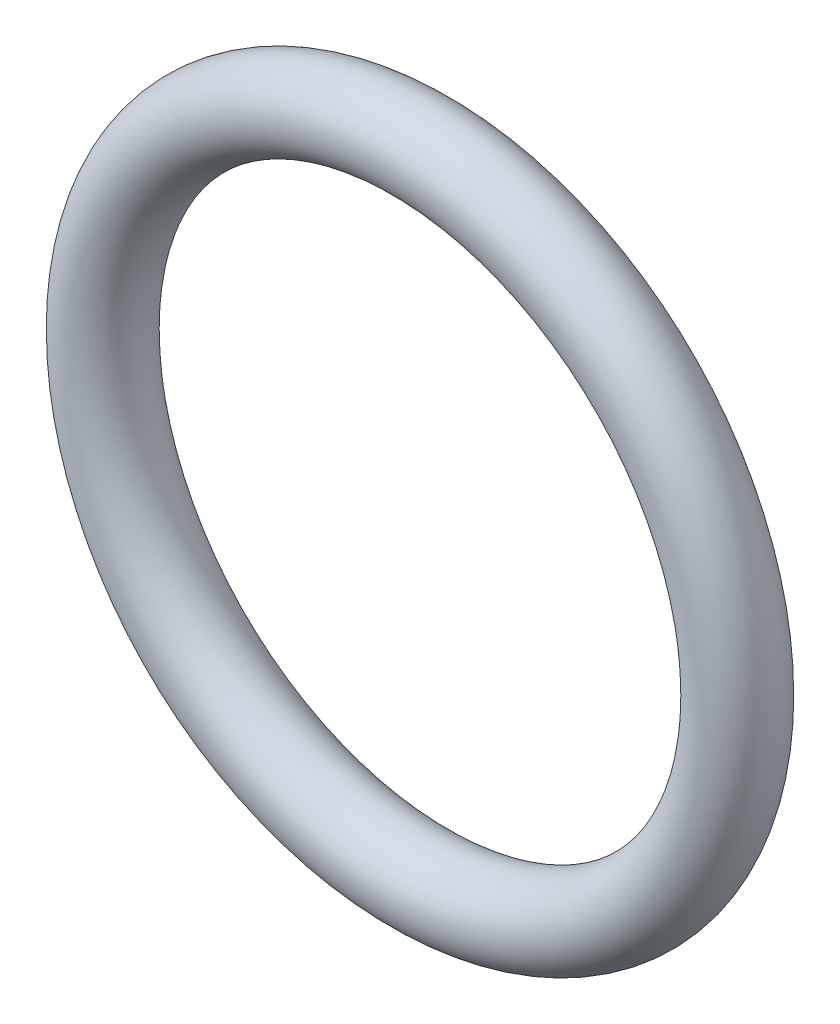
ISO-10303-21;
HEADER;
FILE_DESCRIPTION(('STEP AP214'),'2;1');
FILE_NAME('part.step','',(''),(''),'','','');
FILE_SCHEMA(('AUTOMOTIVE_DESIGN { 1 0 10303 214 1 1 1 1 }'));
ENDSEC;
DATA;
#1=APPLICATION_CONTEXT('core data for automotive mechanical design processes');
#2=APPLICATION_PROTOCOL_DEFINITION('international standard','automotive_design',2000,#1);
#3=PRODUCT_CONTEXT('',#1,'mechanical');
#4=PRODUCT('Part','Part','',(#3));
#5=PRODUCT_RELATED_PRODUCT_CATEGORY('part','',(#4));
#6=PRODUCT_DEFINITION_FORMATION('','',#4);
#7=PRODUCT_DEFINITION_CONTEXT('part definition',#1,'design');
#8=PRODUCT_DEFINITION('design','',#6,#7);
#9=PRODUCT_DEFINITION_SHAPE('','',#8);
#10=(LENGTH_UNIT() NAMED_UNIT(*) SI_UNIT(.MILLI.,.METRE.));
#11=(NAMED_UNIT(*) PLANE_ANGLE_UNIT() SI_UNIT($,.RADIAN.));
#12=(NAMED_UNIT(*) SI_UNIT($,.STERADIAN.) SOLID_ANGLE_UNIT());
#13=UNCERTAINTY_MEASURE_WITH_UNIT(LENGTH_MEASURE(1.E-05),#10,'distance_accuracy_value','');
#14=(GEOMETRIC_REPRESENTATION_CONTEXT(3) GLOBAL_UNCERTAINTY_ASSIGNED_CONTEXT((#13)) GLOBAL_UNIT_ASSIGNED_CONTEXT((#10,
#11,#12)) REPRESENTATION_CONTEXT('',''));
#15=CARTESIAN_POINT('',(0.,0.,0.));
#16=DIRECTION('',(0.,0.,1.));
#17=DIRECTION('',(1.,0.,0.));
#18=AXIS2_PLACEMENT_3D('',#15,#16,#17);
#19=CARTESIAN_POINT('',(0.,0.,0.));
#20=DIRECTION('',(0.,0.,-1.));
#21=DIRECTION('',(-1.,0.,0.));
#22=AXIS2_PLACEMENT_3D('',#19,#20,#21);
#23=TOROIDAL_SURFACE('',#22,7.15,0.899999999999999);
#24=CARTESIAN_POINT('',(-8.05,0.,0.));
#25=VERTEX_POINT('',#24);
#26=VERTEX_LOOP('',#25);
#27=FACE_BOUND('',#26,.T.);
#28=ADVANCED_FACE('F30',(#27),#23,.T.);
#29=CLOSED_SHELL('',(#28));
#30=MANIFOLD_SOLID_BREP('B2',#29);
#31=ADVANCED_BREP_SHAPE_REPRESENTATION('',(#18,#30),#14);
#32=SHAPE_DEFINITION_REPRESENTATION(#9,#31);
ENDSEC;
END-ISO-10303-21;
